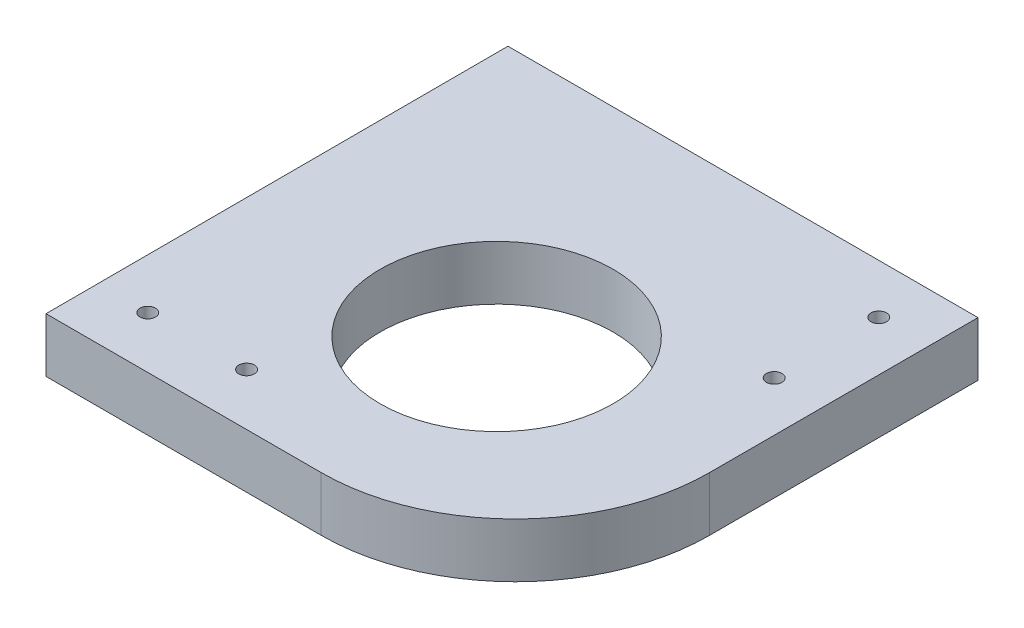
ISO-10303-21;
HEADER;
FILE_DESCRIPTION(('STEP AP214'),'2;1');
FILE_NAME('part.step','',(''),(''),'','','');
FILE_SCHEMA(('AUTOMOTIVE_DESIGN { 1 0 10303 214 1 1 1 1 }'));
ENDSEC;
DATA;
#1=APPLICATION_CONTEXT('core data for automotive mechanical design processes');
#2=APPLICATION_PROTOCOL_DEFINITION('international standard','automotive_design',2000,#1);
#3=PRODUCT_CONTEXT('',#1,'mechanical');
#4=PRODUCT('Part','Part','',(#3));
#5=PRODUCT_RELATED_PRODUCT_CATEGORY('part','',(#4));
#6=PRODUCT_DEFINITION_FORMATION('','',#4);
#7=PRODUCT_DEFINITION_CONTEXT('part definition',#1,'design');
#8=PRODUCT_DEFINITION('design','',#6,#7);
#9=PRODUCT_DEFINITION_SHAPE('','',#8);
#10=(LENGTH_UNIT() NAMED_UNIT(*) SI_UNIT(.MILLI.,.METRE.));
#11=(NAMED_UNIT(*) PLANE_ANGLE_UNIT() SI_UNIT($,.RADIAN.));
#12=(NAMED_UNIT(*) SI_UNIT($,.STERADIAN.) SOLID_ANGLE_UNIT());
#13=UNCERTAINTY_MEASURE_WITH_UNIT(LENGTH_MEASURE(1.E-05),#10,'distance_accuracy_value','');
#14=(GEOMETRIC_REPRESENTATION_CONTEXT(3) GLOBAL_UNCERTAINTY_ASSIGNED_CONTEXT((#13)) GLOBAL_UNIT_ASSIGNED_CONTEXT((#10,
#11,#12)) REPRESENTATION_CONTEXT('',''));
#15=CARTESIAN_POINT('',(0.,0.,0.));
#16=DIRECTION('',(0.,0.,1.));
#17=DIRECTION('',(1.,0.,0.));
#18=AXIS2_PLACEMENT_3D('',#15,#16,#17);
#19=CARTESIAN_POINT('',(0.,0.,0.));
#20=DIRECTION('',(0.,1.,0.));
#21=DIRECTION('',(0.,0.,1.));
#22=AXIS2_PLACEMENT_3D('',#19,#20,#21);
#23=PLANE('',#22);
#24=CARTESIAN_POINT('',(-8.94308718223526,0.,-125.084198666226));
#25=DIRECTION('',(0.,-1.,0.));
#26=DIRECTION('',(0.,0.,-1.));
#27=AXIS2_PLACEMENT_3D('',#24,#25,#26);
#28=CIRCLE('',#27,50.);
#29=CARTESIAN_POINT('',(-8.94308718223526,0.,-75.0841986662262));
#30=VERTEX_POINT('',#29);
#31=CARTESIAN_POINT('',(41.0569128177647,0.,-125.084198666226));
#32=VERTEX_POINT('',#31);
#33=EDGE_CURVE('E68',#30,#32,#28,.F.);
#34=ORIENTED_EDGE('',*,*,#33,.F.);
#35=DIRECTION('',(-1.,0.,0.));
#36=VECTOR('',#35,1.);
#37=CARTESIAN_POINT('',(-79.7936884669927,0.,-75.0841986662262));
#38=LINE('',#37,#36);
#39=CARTESIAN_POINT('',(-79.7936884669927,0.,-75.0841986662262));
#40=VERTEX_POINT('',#39);
#41=EDGE_CURVE('E60',#30,#40,#38,.T.);
#42=ORIENTED_EDGE('',*,*,#41,.T.);
#43=DIRECTION('',(-0.00146295028681035,0.,-0.999998929887657));
#44=VECTOR('',#43,1.);
#45=CARTESIAN_POINT('',(-79.7936884669927,0.,-75.0841986662262));
#46=LINE('',#45,#44);
#47=CARTESIAN_POINT('',(-79.9679405530179,0.,-194.194124086725));
#48=VERTEX_POINT('',#47);
#49=EDGE_CURVE('E102',#40,#48,#46,.T.);
#50=ORIENTED_EDGE('',*,*,#49,.T.);
#51=DIRECTION('',(1.,0.,0.));
#52=VECTOR('',#51,1.);
#53=CARTESIAN_POINT('',(-79.9679405530179,0.,-194.194124086725));
#54=LINE('',#53,#52);
#55=CARTESIAN_POINT('',(41.0569128177647,0.,-194.194124086725));
#56=VERTEX_POINT('',#55);
#57=EDGE_CURVE('E71',#48,#56,#54,.T.);
#58=ORIENTED_EDGE('',*,*,#57,.T.);
#59=DIRECTION('',(0.,0.,1.));
#60=VECTOR('',#59,1.);
#61=CARTESIAN_POINT('',(41.0569128177647,0.,-75.0841986662262));
#62=LINE('',#61,#60);
#63=EDGE_CURVE('E65',#56,#32,#62,.T.);
#64=ORIENTED_EDGE('',*,*,#63,.T.);
#65=EDGE_LOOP('',(#34,#42,#50,#58,#64));
#66=FACE_BOUND('',#65,.T.);
#67=CARTESIAN_POINT('',(-16.6979707415829,0.,-128.009555974968));
#68=DIRECTION('',(0.,-1.,0.));
#69=DIRECTION('',(0.,0.,-1.));
#70=AXIS2_PLACEMENT_3D('',#67,#68,#69);
#71=CIRCLE('',#70,29.9999999999452);
#72=CARTESIAN_POINT('',(-16.6979707415829,0.,-158.009555974914));
#73=VERTEX_POINT('',#72);
#74=EDGE_CURVE('E108',#73,#73,#71,.F.);
#75=ORIENTED_EDGE('',*,*,#74,.T.);
#76=EDGE_LOOP('',(#75));
#77=FACE_BOUND('',#76,.T.);
#78=CARTESIAN_POINT('',(28.2686688581726,0.,-154.50666828815));
#79=DIRECTION('',(0.,1.,0.));
#80=DIRECTION('',(0.,0.,1.));
#81=AXIS2_PLACEMENT_3D('',#78,#79,#80);
#82=CIRCLE('',#81,2.);
#83=CARTESIAN_POINT('',(28.2686688581726,0.,-152.50666828815));
#84=VERTEX_POINT('',#83);
#85=EDGE_CURVE('E139',#84,#84,#82,.T.);
#86=ORIENTED_EDGE('',*,*,#85,.T.);
#87=EDGE_LOOP('',(#86));
#88=FACE_BOUND('',#87,.T.);
#89=CARTESIAN_POINT('',(-41.5401451903556,0.,-88.4647158922932));
#90=DIRECTION('',(0.,1.,0.));
#91=DIRECTION('',(0.,0.,1.));
#92=AXIS2_PLACEMENT_3D('',#89,#90,#91);
#93=CIRCLE('',#92,2.);
#94=CARTESIAN_POINT('',(-41.5401451903556,0.,-86.4647158922932));
#95=VERTEX_POINT('',#94);
#96=EDGE_CURVE('E142',#95,#95,#93,.T.);
#97=ORIENTED_EDGE('',*,*,#96,.T.);
#98=EDGE_LOOP('',(#97));
#99=FACE_BOUND('',#98,.T.);
#100=CARTESIAN_POINT('',(-66.9401180095021,0.,-88.4275569550082));
#101=DIRECTION('',(0.,1.,0.));
#102=DIRECTION('',(0.,0.,1.));
#103=AXIS2_PLACEMENT_3D('',#100,#101,#102);
#104=CIRCLE('',#103,1.99999999999999);
#105=CARTESIAN_POINT('',(-66.9401180095021,0.,-86.4275569550082));
#106=VERTEX_POINT('',#105);
#107=EDGE_CURVE('E144',#106,#106,#104,.T.);
#108=ORIENTED_EDGE('',*,*,#107,.T.);
#109=EDGE_LOOP('',(#108));
#110=FACE_BOUND('',#109,.T.);
#111=CARTESIAN_POINT('',(28.2292149907727,0.,-181.475339428611));
#112=DIRECTION('',(0.,1.,0.));
#113=DIRECTION('',(0.,0.,1.));
#114=AXIS2_PLACEMENT_3D('',#111,#112,#113);
#115=CIRCLE('',#114,2.);
#116=CARTESIAN_POINT('',(28.2292149907727,0.,-179.475339428611));
#117=VERTEX_POINT('',#116);
#118=EDGE_CURVE('E20',#117,#117,#115,.T.);
#119=ORIENTED_EDGE('',*,*,#118,.T.);
#120=EDGE_LOOP('',(#119));
#121=FACE_BOUND('',#120,.T.);
#122=ADVANCED_FACE('F17',(#66,#77,#88,#99,#110,#121),#23,.F.);
#123=CARTESIAN_POINT('',(28.2292149907727,-36.,-181.475339428611));
#124=DIRECTION('',(0.,1.,0.));
#125=DIRECTION('',(0.,0.,1.));
#126=AXIS2_PLACEMENT_3D('',#123,#124,#125);
#127=CYLINDRICAL_SURFACE('',#126,2.);
#128=CARTESIAN_POINT('',(28.2292149907727,14.,-181.475339428611));
#129=DIRECTION('',(0.,1.,0.));
#130=DIRECTION('',(0.,0.,1.));
#131=AXIS2_PLACEMENT_3D('',#128,#129,#130);
#132=CIRCLE('',#131,2.);
#133=CARTESIAN_POINT('',(28.2292149907727,14.,-179.475339428611));
#134=VERTEX_POINT('',#133);
#135=EDGE_CURVE('E112',#134,#134,#132,.F.);
#136=ORIENTED_EDGE('',*,*,#135,.F.);
#137=EDGE_LOOP('',(#136));
#138=FACE_BOUND('',#137,.T.);
#139=ORIENTED_EDGE('',*,*,#118,.F.);
#140=EDGE_LOOP('',(#139));
#141=FACE_BOUND('',#140,.T.);
#142=ADVANCED_FACE('F152',(#138,#141),#127,.F.);
#143=CARTESIAN_POINT('',(-66.9401180095021,-36.,-88.4275569550082));
#144=DIRECTION('',(0.,1.,0.));
#145=DIRECTION('',(0.,0.,1.));
#146=AXIS2_PLACEMENT_3D('',#143,#144,#145);
#147=CYLINDRICAL_SURFACE('',#146,1.99999999999999);
#148=CARTESIAN_POINT('',(-66.9401180095021,14.,-88.4275569550082));
#149=DIRECTION('',(0.,1.,0.));
#150=DIRECTION('',(0.,0.,1.));
#151=AXIS2_PLACEMENT_3D('',#148,#149,#150);
#152=CIRCLE('',#151,1.99999999999999);
#153=CARTESIAN_POINT('',(-66.9401180095021,14.,-86.4275569550082));
#154=VERTEX_POINT('',#153);
#155=EDGE_CURVE('E132',#154,#154,#152,.F.);
#156=ORIENTED_EDGE('',*,*,#155,.F.);
#157=EDGE_LOOP('',(#156));
#158=FACE_BOUND('',#157,.T.);
#159=ORIENTED_EDGE('',*,*,#107,.F.);
#160=EDGE_LOOP('',(#159));
#161=FACE_BOUND('',#160,.T.);
#162=ADVANCED_FACE('F154',(#158,#161),#147,.F.);
#163=CARTESIAN_POINT('',(-41.5401451903556,-36.,-88.4647158922932));
#164=DIRECTION('',(0.,1.,0.));
#165=DIRECTION('',(0.,0.,1.));
#166=AXIS2_PLACEMENT_3D('',#163,#164,#165);
#167=CYLINDRICAL_SURFACE('',#166,2.);
#168=CARTESIAN_POINT('',(-41.5401451903556,14.,-88.4647158922932));
#169=DIRECTION('',(0.,1.,0.));
#170=DIRECTION('',(0.,0.,1.));
#171=AXIS2_PLACEMENT_3D('',#168,#169,#170);
#172=CIRCLE('',#171,2.);
#173=CARTESIAN_POINT('',(-41.5401451903556,14.,-86.4647158922932));
#174=VERTEX_POINT('',#173);
#175=EDGE_CURVE('E129',#174,#174,#172,.F.);
#176=ORIENTED_EDGE('',*,*,#175,.F.);
#177=EDGE_LOOP('',(#176));
#178=FACE_BOUND('',#177,.T.);
#179=ORIENTED_EDGE('',*,*,#96,.F.);
#180=EDGE_LOOP('',(#179));
#181=FACE_BOUND('',#180,.T.);
#182=ADVANCED_FACE('F161',(#178,#181),#167,.F.);
#183=CARTESIAN_POINT('',(28.2686688581726,-36.,-154.50666828815));
#184=DIRECTION('',(0.,1.,0.));
#185=DIRECTION('',(0.,0.,1.));
#186=AXIS2_PLACEMENT_3D('',#183,#184,#185);
#187=CYLINDRICAL_SURFACE('',#186,2.);
#188=CARTESIAN_POINT('',(28.2686688581726,14.,-154.50666828815));
#189=DIRECTION('',(0.,1.,0.));
#190=DIRECTION('',(0.,0.,1.));
#191=AXIS2_PLACEMENT_3D('',#188,#189,#190);
#192=CIRCLE('',#191,2.);
#193=CARTESIAN_POINT('',(28.2686688581726,14.,-152.50666828815));
#194=VERTEX_POINT('',#193);
#195=EDGE_CURVE('E126',#194,#194,#192,.F.);
#196=ORIENTED_EDGE('',*,*,#195,.F.);
#197=EDGE_LOOP('',(#196));
#198=FACE_BOUND('',#197,.T.);
#199=ORIENTED_EDGE('',*,*,#85,.F.);
#200=EDGE_LOOP('',(#199));
#201=FACE_BOUND('',#200,.T.);
#202=ADVANCED_FACE('F190',(#198,#201),#187,.F.);
#203=CARTESIAN_POINT('',(-16.6979707415829,24.,-128.009555974968));
#204=DIRECTION('',(0.,-1.,0.));
#205=DIRECTION('',(0.,0.,-1.));
#206=AXIS2_PLACEMENT_3D('',#203,#204,#205);
#207=CYLINDRICAL_SURFACE('',#206,29.9999999999452);
#208=ORIENTED_EDGE('',*,*,#74,.F.);
#209=EDGE_LOOP('',(#208));
#210=FACE_BOUND('',#209,.T.);
#211=CARTESIAN_POINT('',(-16.6979707415829,14.,-128.009555974968));
#212=DIRECTION('',(0.,-1.,0.));
#213=DIRECTION('',(0.,0.,-1.));
#214=AXIS2_PLACEMENT_3D('',#211,#212,#213);
#215=CIRCLE('',#214,29.9999999999452);
#216=CARTESIAN_POINT('',(-16.6979707415829,14.,-158.009555974914));
#217=VERTEX_POINT('',#216);
#218=EDGE_CURVE('E123',#217,#217,#215,.T.);
#219=ORIENTED_EDGE('',*,*,#218,.F.);
#220=EDGE_LOOP('',(#219));
#221=FACE_BOUND('',#220,.T.);
#222=ADVANCED_FACE('F187',(#210,#221),#207,.F.);
#223=CARTESIAN_POINT('',(-79.7936884669927,14.,-75.0841986662262));
#224=DIRECTION('',(0.,0.,-1.));
#225=DIRECTION('',(-1.,0.,0.));
#226=AXIS2_PLACEMENT_3D('',#223,#224,#225);
#227=PLANE('',#226);
#228=DIRECTION('',(0.,-1.,0.));
#229=VECTOR('',#228,1.);
#230=CARTESIAN_POINT('',(-8.94308718223527,14.,-75.0841986662262));
#231=LINE('',#230,#229);
#232=CARTESIAN_POINT('',(-8.94308718223526,14.,-75.0841986662262));
#233=VERTEX_POINT('',#232);
#234=EDGE_CURVE('E81',#233,#30,#231,.T.);
#235=ORIENTED_EDGE('',*,*,#234,.F.);
#236=DIRECTION('',(1.,0.,0.));
#237=VECTOR('',#236,1.);
#238=CARTESIAN_POINT('',(0.,14.,-75.0841986662262));
#239=LINE('',#238,#237);
#240=CARTESIAN_POINT('',(-79.7936884669927,14.,-75.0841986662262));
#241=VERTEX_POINT('',#240);
#242=EDGE_CURVE('E122',#241,#233,#239,.T.);
#243=ORIENTED_EDGE('',*,*,#242,.F.);
#244=DIRECTION('',(0.,1.,0.));
#245=VECTOR('',#244,1.);
#246=CARTESIAN_POINT('',(-79.7936884669927,14.,-75.0841986662262));
#247=LINE('',#246,#245);
#248=EDGE_CURVE('E100',#241,#40,#247,.F.);
#249=ORIENTED_EDGE('',*,*,#248,.T.);
#250=ORIENTED_EDGE('',*,*,#41,.F.);
#251=EDGE_LOOP('',(#235,#243,#249,#250));
#252=FACE_BOUND('',#251,.T.);
#253=ADVANCED_FACE('F184',(#252),#227,.F.);
#254=CARTESIAN_POINT('',(-8.94308718223526,14.,-125.084198666226));
#255=DIRECTION('',(0.,-1.,0.));
#256=DIRECTION('',(0.,0.,-1.));
#257=AXIS2_PLACEMENT_3D('',#254,#255,#256);
#258=CYLINDRICAL_SURFACE('',#257,50.);
#259=ORIENTED_EDGE('',*,*,#33,.T.);
#260=DIRECTION('',(0.,1.,0.));
#261=VECTOR('',#260,1.);
#262=CARTESIAN_POINT('',(41.0569128177647,14.,-125.084198666226));
#263=LINE('',#262,#261);
#264=CARTESIAN_POINT('',(41.0569128177647,14.,-125.084198666226));
#265=VERTEX_POINT('',#264);
#266=EDGE_CURVE('E75',#32,#265,#263,.T.);
#267=ORIENTED_EDGE('',*,*,#266,.T.);
#268=CARTESIAN_POINT('',(-8.94308718223526,14.,-125.084198666226));
#269=DIRECTION('',(0.,-1.,0.));
#270=DIRECTION('',(0.,0.,-1.));
#271=AXIS2_PLACEMENT_3D('',#268,#269,#270);
#272=CIRCLE('',#271,50.);
#273=EDGE_CURVE('E120',#233,#265,#272,.F.);
#274=ORIENTED_EDGE('',*,*,#273,.F.);
#275=ORIENTED_EDGE('',*,*,#234,.T.);
#276=EDGE_LOOP('',(#259,#267,#274,#275));
#277=FACE_BOUND('',#276,.T.);
#278=ADVANCED_FACE('F78',(#277),#258,.T.);
#279=CARTESIAN_POINT('',(41.0569128177647,14.,-75.0841986662262));
#280=DIRECTION('',(-1.,0.,0.));
#281=DIRECTION('',(0.,0.,1.));
#282=AXIS2_PLACEMENT_3D('',#279,#280,#281);
#283=PLANE('',#282);
#284=ORIENTED_EDGE('',*,*,#266,.F.);
#285=ORIENTED_EDGE('',*,*,#63,.F.);
#286=DIRECTION('',(0.,1.,0.));
#287=VECTOR('',#286,1.);
#288=CARTESIAN_POINT('',(41.0569128177647,14.,-194.194124086725));
#289=LINE('',#288,#287);
#290=CARTESIAN_POINT('',(41.0569128177647,14.,-194.194124086725));
#291=VERTEX_POINT('',#290);
#292=EDGE_CURVE('E87',#56,#291,#289,.T.);
#293=ORIENTED_EDGE('',*,*,#292,.T.);
#294=DIRECTION('',(0.,0.,1.));
#295=VECTOR('',#294,1.);
#296=CARTESIAN_POINT('',(41.0569128177647,14.,0.));
#297=LINE('',#296,#295);
#298=EDGE_CURVE('E85',#265,#291,#297,.F.);
#299=ORIENTED_EDGE('',*,*,#298,.F.);
#300=EDGE_LOOP('',(#284,#285,#293,#299));
#301=FACE_BOUND('',#300,.T.);
#302=ADVANCED_FACE('F83',(#301),#283,.F.);
#303=CARTESIAN_POINT('',(-79.9679405530179,14.,-194.194124086725));
#304=DIRECTION('',(0.,0.,1.));
#305=DIRECTION('',(1.,0.,0.));
#306=AXIS2_PLACEMENT_3D('',#303,#304,#305);
#307=PLANE('',#306);
#308=DIRECTION('',(0.,1.,0.));
#309=VECTOR('',#308,1.);
#310=CARTESIAN_POINT('',(-79.9679405530179,14.,-194.194124086725));
#311=LINE('',#310,#309);
#312=CARTESIAN_POINT('',(-79.9679405530179,14.,-194.194124086725));
#313=VERTEX_POINT('',#312);
#314=EDGE_CURVE('E35',#48,#313,#311,.T.);
#315=ORIENTED_EDGE('',*,*,#314,.T.);
#316=DIRECTION('',(1.,0.,0.));
#317=VECTOR('',#316,1.);
#318=CARTESIAN_POINT('',(0.,14.,-194.194124086725));
#319=LINE('',#318,#317);
#320=EDGE_CURVE('E26',#291,#313,#319,.F.);
#321=ORIENTED_EDGE('',*,*,#320,.F.);
#322=ORIENTED_EDGE('',*,*,#292,.F.);
#323=ORIENTED_EDGE('',*,*,#57,.F.);
#324=EDGE_LOOP('',(#315,#321,#322,#323));
#325=FACE_BOUND('',#324,.T.);
#326=ADVANCED_FACE('F173',(#325),#307,.F.);
#327=CARTESIAN_POINT('',(-79.7936884669927,14.,-75.0841986662262));
#328=DIRECTION('',(0.999998929887657,0.,-0.00146295028681035));
#329=DIRECTION('',(-0.00146295028681035,0.,-0.999998929887657));
#330=AXIS2_PLACEMENT_3D('',#327,#328,#329);
#331=PLANE('',#330);
#332=ORIENTED_EDGE('',*,*,#248,.F.);
#333=DIRECTION('',(0.00146295028681035,0.,0.999998929887657));
#334=VECTOR('',#333,1.);
#335=CARTESIAN_POINT('',(-79.9679405530179,14.,-194.194124086725));
#336=LINE('',#335,#334);
#337=EDGE_CURVE('E11',#313,#241,#336,.T.);
#338=ORIENTED_EDGE('',*,*,#337,.F.);
#339=ORIENTED_EDGE('',*,*,#314,.F.);
#340=ORIENTED_EDGE('',*,*,#49,.F.);
#341=EDGE_LOOP('',(#332,#338,#339,#340));
#342=FACE_BOUND('',#341,.T.);
#343=ADVANCED_FACE('F167',(#342),#331,.F.);
#344=CARTESIAN_POINT('',(0.,14.,0.));
#345=DIRECTION('',(0.,1.,0.));
#346=DIRECTION('',(0.,0.,1.));
#347=AXIS2_PLACEMENT_3D('',#344,#345,#346);
#348=PLANE('',#347);
#349=ORIENTED_EDGE('',*,*,#320,.T.);
#350=ORIENTED_EDGE('',*,*,#337,.T.);
#351=ORIENTED_EDGE('',*,*,#242,.T.);
#352=ORIENTED_EDGE('',*,*,#273,.T.);
#353=ORIENTED_EDGE('',*,*,#298,.T.);
#354=EDGE_LOOP('',(#349,#350,#351,#352,#353));
#355=FACE_BOUND('',#354,.T.);
#356=ORIENTED_EDGE('',*,*,#218,.T.);
#357=EDGE_LOOP('',(#356));
#358=FACE_BOUND('',#357,.T.);
#359=ORIENTED_EDGE('',*,*,#195,.T.);
#360=EDGE_LOOP('',(#359));
#361=FACE_BOUND('',#360,.T.);
#362=ORIENTED_EDGE('',*,*,#175,.T.);
#363=EDGE_LOOP('',(#362));
#364=FACE_BOUND('',#363,.T.);
#365=ORIENTED_EDGE('',*,*,#155,.T.);
#366=EDGE_LOOP('',(#365));
#367=FACE_BOUND('',#366,.T.);
#368=ORIENTED_EDGE('',*,*,#135,.T.);
#369=EDGE_LOOP('',(#368));
#370=FACE_BOUND('',#369,.T.);
#371=ADVANCED_FACE('F165',(#355,#358,#361,#364,#367,#370),#348,.T.);
#372=CLOSED_SHELL('',(#122,#142,#162,#182,#202,#222,#253,#278,#302,#326,#343,#371));
#373=MANIFOLD_SOLID_BREP('B1',#372);
#374=ADVANCED_BREP_SHAPE_REPRESENTATION('',(#18,#373),#14);
#375=SHAPE_DEFINITION_REPRESENTATION(#9,#374);
ENDSEC;
END-ISO-10303-21;
